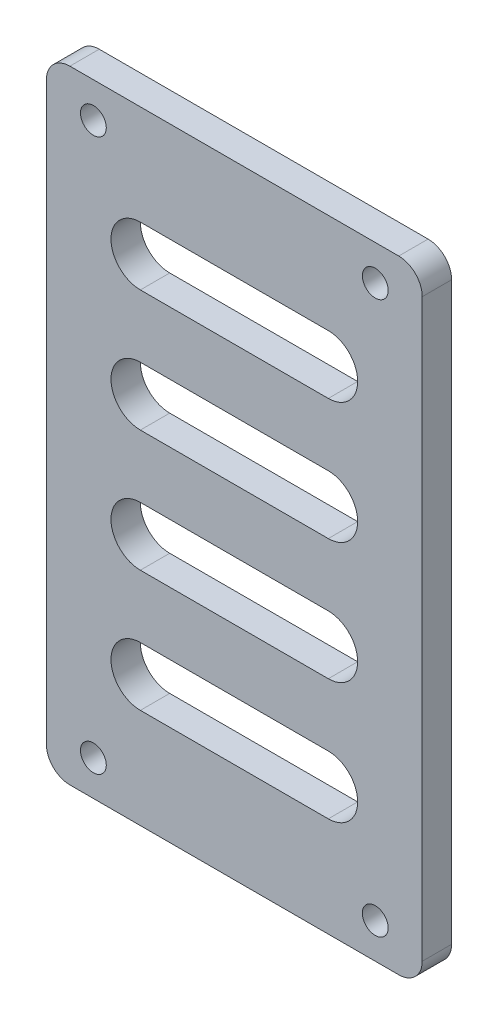
ISO-10303-21;
HEADER;
FILE_DESCRIPTION(('STEP AP214'),'2;1');
FILE_NAME('part.step','',(''),(''),'','','');
FILE_SCHEMA(('AUTOMOTIVE_DESIGN { 1 0 10303 214 1 1 1 1 }'));
ENDSEC;
DATA;
#1=APPLICATION_CONTEXT('core data for automotive mechanical design processes');
#2=APPLICATION_PROTOCOL_DEFINITION('international standard','automotive_design',2000,#1);
#3=PRODUCT_CONTEXT('',#1,'mechanical');
#4=PRODUCT('Part','Part','',(#3));
#5=PRODUCT_RELATED_PRODUCT_CATEGORY('part','',(#4));
#6=PRODUCT_DEFINITION_FORMATION('','',#4);
#7=PRODUCT_DEFINITION_CONTEXT('part definition',#1,'design');
#8=PRODUCT_DEFINITION('design','',#6,#7);
#9=PRODUCT_DEFINITION_SHAPE('','',#8);
#10=(LENGTH_UNIT() NAMED_UNIT(*) SI_UNIT(.MILLI.,.METRE.));
#11=(NAMED_UNIT(*) PLANE_ANGLE_UNIT() SI_UNIT($,.RADIAN.));
#12=(NAMED_UNIT(*) SI_UNIT($,.STERADIAN.) SOLID_ANGLE_UNIT());
#13=UNCERTAINTY_MEASURE_WITH_UNIT(LENGTH_MEASURE(1.E-05),#10,'distance_accuracy_value','');
#14=(GEOMETRIC_REPRESENTATION_CONTEXT(3) GLOBAL_UNCERTAINTY_ASSIGNED_CONTEXT((#13)) GLOBAL_UNIT_ASSIGNED_CONTEXT((#10,
#11,#12)) REPRESENTATION_CONTEXT('',''));
#15=CARTESIAN_POINT('',(0.,0.,0.));
#16=DIRECTION('',(0.,0.,1.));
#17=DIRECTION('',(1.,0.,0.));
#18=AXIS2_PLACEMENT_3D('',#15,#16,#17);
#19=CARTESIAN_POINT('',(0.,0.,2.5));
#20=DIRECTION('',(0.,0.,-1.));
#21=DIRECTION('',(-1.,0.,0.));
#22=AXIS2_PLACEMENT_3D('',#19,#20,#21);
#23=PLANE('',#22);
#24=DIRECTION('',(1.,0.,0.));
#25=VECTOR('',#24,1.);
#26=CARTESIAN_POINT('',(-8.,13.,2.5));
#27=LINE('',#26,#25);
#28=CARTESIAN_POINT('',(-8.,13.,2.5));
#29=VERTEX_POINT('',#28);
#30=CARTESIAN_POINT('',(8.,13.,2.5));
#31=VERTEX_POINT('',#30);
#32=EDGE_CURVE('E247',#29,#31,#27,.T.);
#33=ORIENTED_EDGE('',*,*,#32,.F.);
#34=CARTESIAN_POINT('',(-8.,15.5,2.5));
#35=DIRECTION('',(0.,0.,1.));
#36=DIRECTION('',(1.,0.,0.));
#37=AXIS2_PLACEMENT_3D('',#34,#35,#36);
#38=CIRCLE('',#37,2.5);
#39=CARTESIAN_POINT('',(-8.,18.,2.5));
#40=VERTEX_POINT('',#39);
#41=EDGE_CURVE('E214',#40,#29,#38,.T.);
#42=ORIENTED_EDGE('',*,*,#41,.F.);
#43=DIRECTION('',(-1.,0.,0.));
#44=VECTOR('',#43,1.);
#45=CARTESIAN_POINT('',(-8.,18.,2.5));
#46=LINE('',#45,#44);
#47=CARTESIAN_POINT('',(8.,18.,2.5));
#48=VERTEX_POINT('',#47);
#49=EDGE_CURVE('E237',#48,#40,#46,.T.);
#50=ORIENTED_EDGE('',*,*,#49,.F.);
#51=CARTESIAN_POINT('',(8.,15.5,2.5));
#52=DIRECTION('',(0.,0.,1.));
#53=DIRECTION('',(1.,0.,0.));
#54=AXIS2_PLACEMENT_3D('',#51,#52,#53);
#55=CIRCLE('',#54,2.5);
#56=EDGE_CURVE('E238',#31,#48,#55,.T.);
#57=ORIENTED_EDGE('',*,*,#56,.F.);
#58=EDGE_LOOP('',(#33,#42,#50,#57));
#59=FACE_BOUND('',#58,.T.);
#60=DIRECTION('',(1.,0.,0.));
#61=VECTOR('',#60,1.);
#62=CARTESIAN_POINT('',(-7.99999999999989,2.66666666666666,2.5));
#63=LINE('',#62,#61);
#64=CARTESIAN_POINT('',(-7.99999999999989,2.66666666666666,2.5));
#65=VERTEX_POINT('',#64);
#66=CARTESIAN_POINT('',(8.00000000000011,2.66666666666666,2.5));
#67=VERTEX_POINT('',#66);
#68=EDGE_CURVE('E287',#65,#67,#63,.T.);
#69=ORIENTED_EDGE('',*,*,#68,.F.);
#70=CARTESIAN_POINT('',(-7.99999999999989,5.16666666666667,2.5));
#71=DIRECTION('',(0.,0.,1.));
#72=DIRECTION('',(1.,0.,0.));
#73=AXIS2_PLACEMENT_3D('',#70,#71,#72);
#74=CIRCLE('',#73,2.5);
#75=CARTESIAN_POINT('',(-7.99999999999989,7.66666666666667,2.5));
#76=VERTEX_POINT('',#75);
#77=EDGE_CURVE('E249',#76,#65,#74,.T.);
#78=ORIENTED_EDGE('',*,*,#77,.F.);
#79=DIRECTION('',(-1.,0.,0.));
#80=VECTOR('',#79,1.);
#81=CARTESIAN_POINT('',(-7.99999999999989,7.66666666666667,2.5));
#82=LINE('',#81,#80);
#83=CARTESIAN_POINT('',(8.00000000000011,7.66666666666667,2.5));
#84=VERTEX_POINT('',#83);
#85=EDGE_CURVE('E278',#84,#76,#82,.T.);
#86=ORIENTED_EDGE('',*,*,#85,.F.);
#87=CARTESIAN_POINT('',(8.00000000000011,5.16666666666667,2.5));
#88=DIRECTION('',(0.,0.,1.));
#89=DIRECTION('',(1.,0.,0.));
#90=AXIS2_PLACEMENT_3D('',#87,#88,#89);
#91=CIRCLE('',#90,2.5);
#92=EDGE_CURVE('E285',#67,#84,#91,.T.);
#93=ORIENTED_EDGE('',*,*,#92,.F.);
#94=EDGE_LOOP('',(#69,#78,#86,#93));
#95=FACE_BOUND('',#94,.T.);
#96=DIRECTION('',(1.,0.,0.));
#97=VECTOR('',#96,1.);
#98=CARTESIAN_POINT('',(-7.99999999999979,-7.66666666666667,2.5));
#99=LINE('',#98,#97);
#100=CARTESIAN_POINT('',(-7.99999999999979,-7.66666666666667,2.5));
#101=VERTEX_POINT('',#100);
#102=CARTESIAN_POINT('',(8.00000000000021,-7.66666666666667,2.5));
#103=VERTEX_POINT('',#102);
#104=EDGE_CURVE('E334',#101,#103,#99,.T.);
#105=ORIENTED_EDGE('',*,*,#104,.F.);
#106=CARTESIAN_POINT('',(-7.99999999999979,-5.16666666666667,2.5));
#107=DIRECTION('',(0.,0.,1.));
#108=DIRECTION('',(1.,0.,0.));
#109=AXIS2_PLACEMENT_3D('',#106,#107,#108);
#110=CIRCLE('',#109,2.5);
#111=CARTESIAN_POINT('',(-7.99999999999979,-2.66666666666667,2.5));
#112=VERTEX_POINT('',#111);
#113=EDGE_CURVE('E276',#112,#101,#110,.T.);
#114=ORIENTED_EDGE('',*,*,#113,.F.);
#115=DIRECTION('',(-1.,0.,0.));
#116=VECTOR('',#115,1.);
#117=CARTESIAN_POINT('',(-7.99999999999979,-2.66666666666667,2.5));
#118=LINE('',#117,#116);
#119=CARTESIAN_POINT('',(8.00000000000021,-2.66666666666667,2.5));
#120=VERTEX_POINT('',#119);
#121=EDGE_CURVE('E322',#120,#112,#118,.T.);
#122=ORIENTED_EDGE('',*,*,#121,.F.);
#123=CARTESIAN_POINT('',(8.00000000000021,-5.16666666666667,2.5));
#124=DIRECTION('',(0.,0.,1.));
#125=DIRECTION('',(1.,0.,0.));
#126=AXIS2_PLACEMENT_3D('',#123,#124,#125);
#127=CIRCLE('',#126,2.5);
#128=EDGE_CURVE('E327',#103,#120,#127,.T.);
#129=ORIENTED_EDGE('',*,*,#128,.F.);
#130=EDGE_LOOP('',(#105,#114,#122,#129));
#131=FACE_BOUND('',#130,.T.);
#132=DIRECTION('',(1.,0.,0.));
#133=VECTOR('',#132,1.);
#134=CARTESIAN_POINT('',(-7.99999999999968,-18.,2.5));
#135=LINE('',#134,#133);
#136=CARTESIAN_POINT('',(-7.99999999999968,-18.,2.5));
#137=VERTEX_POINT('',#136);
#138=CARTESIAN_POINT('',(8.00000000000032,-18.,2.5));
#139=VERTEX_POINT('',#138);
#140=EDGE_CURVE('E376',#137,#139,#135,.T.);
#141=ORIENTED_EDGE('',*,*,#140,.F.);
#142=CARTESIAN_POINT('',(-7.99999999999968,-15.5,2.5));
#143=DIRECTION('',(0.,0.,1.));
#144=DIRECTION('',(1.,0.,0.));
#145=AXIS2_PLACEMENT_3D('',#142,#143,#144);
#146=CIRCLE('',#145,2.5);
#147=CARTESIAN_POINT('',(-7.99999999999968,-13.,2.5));
#148=VERTEX_POINT('',#147);
#149=EDGE_CURVE('E323',#148,#137,#146,.T.);
#150=ORIENTED_EDGE('',*,*,#149,.F.);
#151=DIRECTION('',(-1.,0.,0.));
#152=VECTOR('',#151,1.);
#153=CARTESIAN_POINT('',(-7.99999999999968,-13.,2.5));
#154=LINE('',#153,#152);
#155=CARTESIAN_POINT('',(8.00000000000032,-13.,2.5));
#156=VERTEX_POINT('',#155);
#157=EDGE_CURVE('E370',#156,#148,#154,.T.);
#158=ORIENTED_EDGE('',*,*,#157,.F.);
#159=CARTESIAN_POINT('',(7.99999999999968,-15.5,2.5));
#160=DIRECTION('',(0.,0.,1.));
#161=DIRECTION('',(1.,0.,0.));
#162=AXIS2_PLACEMENT_3D('',#159,#160,#161);
#163=CIRCLE('',#162,2.5);
#164=EDGE_CURVE('E371',#139,#156,#163,.T.);
#165=ORIENTED_EDGE('',*,*,#164,.F.);
#166=EDGE_LOOP('',(#141,#150,#158,#165));
#167=FACE_BOUND('',#166,.T.);
#168=DIRECTION('',(0.,-1.,0.));
#169=VECTOR('',#168,1.);
#170=CARTESIAN_POINT('',(-16.,-26.5,2.5));
#171=LINE('',#170,#169);
#172=CARTESIAN_POINT('',(-16.,24.5,2.5));
#173=VERTEX_POINT('',#172);
#174=CARTESIAN_POINT('',(-16.,-24.5,2.5));
#175=VERTEX_POINT('',#174);
#176=EDGE_CURVE('E434',#173,#175,#171,.T.);
#177=ORIENTED_EDGE('',*,*,#176,.T.);
#178=CARTESIAN_POINT('',(-14.,-24.5,2.5));
#179=DIRECTION('',(0.,0.,-1.));
#180=DIRECTION('',(-1.,0.,0.));
#181=AXIS2_PLACEMENT_3D('',#178,#179,#180);
#182=CIRCLE('',#181,2.);
#183=CARTESIAN_POINT('',(-14.,-26.5,2.5));
#184=VERTEX_POINT('',#183);
#185=EDGE_CURVE('E489',#175,#184,#182,.F.);
#186=ORIENTED_EDGE('',*,*,#185,.T.);
#187=DIRECTION('',(1.,0.,0.));
#188=VECTOR('',#187,1.);
#189=CARTESIAN_POINT('',(-16.,-26.5,2.5));
#190=LINE('',#189,#188);
#191=CARTESIAN_POINT('',(14.,-26.5,2.5));
#192=VERTEX_POINT('',#191);
#193=EDGE_CURVE('E438',#184,#192,#190,.T.);
#194=ORIENTED_EDGE('',*,*,#193,.T.);
#195=CARTESIAN_POINT('',(14.,-24.5,2.5));
#196=DIRECTION('',(0.,0.,-1.));
#197=DIRECTION('',(-1.,0.,0.));
#198=AXIS2_PLACEMENT_3D('',#195,#196,#197);
#199=CIRCLE('',#198,2.);
#200=CARTESIAN_POINT('',(16.,-24.5,2.5));
#201=VERTEX_POINT('',#200);
#202=EDGE_CURVE('E490',#192,#201,#199,.F.);
#203=ORIENTED_EDGE('',*,*,#202,.T.);
#204=DIRECTION('',(0.,1.,0.));
#205=VECTOR('',#204,1.);
#206=CARTESIAN_POINT('',(16.,-26.5,2.5));
#207=LINE('',#206,#205);
#208=CARTESIAN_POINT('',(16.,24.5,2.5));
#209=VERTEX_POINT('',#208);
#210=EDGE_CURVE('E428',#201,#209,#207,.T.);
#211=ORIENTED_EDGE('',*,*,#210,.T.);
#212=CARTESIAN_POINT('',(14.,24.5,2.5));
#213=DIRECTION('',(0.,0.,-1.));
#214=DIRECTION('',(-1.,0.,0.));
#215=AXIS2_PLACEMENT_3D('',#212,#213,#214);
#216=CIRCLE('',#215,2.);
#217=CARTESIAN_POINT('',(14.,26.5,2.5));
#218=VERTEX_POINT('',#217);
#219=EDGE_CURVE('E70',#209,#218,#216,.F.);
#220=ORIENTED_EDGE('',*,*,#219,.T.);
#221=DIRECTION('',(-1.,0.,0.));
#222=VECTOR('',#221,1.);
#223=CARTESIAN_POINT('',(-16.,26.5,2.5));
#224=LINE('',#223,#222);
#225=CARTESIAN_POINT('',(-14.,26.5,2.5));
#226=VERTEX_POINT('',#225);
#227=EDGE_CURVE('E431',#218,#226,#224,.T.);
#228=ORIENTED_EDGE('',*,*,#227,.T.);
#229=CARTESIAN_POINT('',(-14.,24.5,2.5));
#230=DIRECTION('',(0.,0.,-1.));
#231=DIRECTION('',(-1.,0.,0.));
#232=AXIS2_PLACEMENT_3D('',#229,#230,#231);
#233=CIRCLE('',#232,2.);
#234=EDGE_CURVE('E485',#226,#173,#233,.F.);
#235=ORIENTED_EDGE('',*,*,#234,.T.);
#236=EDGE_LOOP('',(#177,#186,#194,#203,#211,#220,#228,#235));
#237=FACE_BOUND('',#236,.T.);
#238=CARTESIAN_POINT('',(-12.,23.5,2.5));
#239=DIRECTION('',(0.,0.,1.));
#240=DIRECTION('',(1.,0.,0.));
#241=AXIS2_PLACEMENT_3D('',#238,#239,#240);
#242=CIRCLE('',#241,1.1);
#243=CARTESIAN_POINT('',(-10.9,23.5,2.5));
#244=VERTEX_POINT('',#243);
#245=EDGE_CURVE('E419',#244,#244,#242,.T.);
#246=ORIENTED_EDGE('',*,*,#245,.F.);
#247=EDGE_LOOP('',(#246));
#248=FACE_BOUND('',#247,.T.);
#249=CARTESIAN_POINT('',(12.,-23.5,2.5));
#250=DIRECTION('',(0.,0.,1.));
#251=DIRECTION('',(1.,0.,0.));
#252=AXIS2_PLACEMENT_3D('',#249,#250,#251);
#253=CIRCLE('',#252,1.1);
#254=CARTESIAN_POINT('',(13.1,-23.5,2.5));
#255=VERTEX_POINT('',#254);
#256=EDGE_CURVE('E415',#255,#255,#253,.T.);
#257=ORIENTED_EDGE('',*,*,#256,.F.);
#258=EDGE_LOOP('',(#257));
#259=FACE_BOUND('',#258,.T.);
#260=CARTESIAN_POINT('',(12.,23.5,2.5));
#261=DIRECTION('',(0.,0.,1.));
#262=DIRECTION('',(1.,0.,0.));
#263=AXIS2_PLACEMENT_3D('',#260,#261,#262);
#264=CIRCLE('',#263,1.09999999999999);
#265=CARTESIAN_POINT('',(13.1,23.5,2.5));
#266=VERTEX_POINT('',#265);
#267=EDGE_CURVE('E404',#266,#266,#264,.T.);
#268=ORIENTED_EDGE('',*,*,#267,.F.);
#269=EDGE_LOOP('',(#268));
#270=FACE_BOUND('',#269,.T.);
#271=CARTESIAN_POINT('',(-12.,-23.5,2.5));
#272=DIRECTION('',(0.,0.,1.));
#273=DIRECTION('',(1.,0.,0.));
#274=AXIS2_PLACEMENT_3D('',#271,#272,#273);
#275=CIRCLE('',#274,1.10000000000001);
#276=CARTESIAN_POINT('',(-10.9,-23.5,2.5));
#277=VERTEX_POINT('',#276);
#278=EDGE_CURVE('E396',#277,#277,#275,.T.);
#279=ORIENTED_EDGE('',*,*,#278,.F.);
#280=EDGE_LOOP('',(#279));
#281=FACE_BOUND('',#280,.T.);
#282=ADVANCED_FACE('F44',(#59,#95,#131,#167,#237,#248,#259,#270,#281),#23,.F.);
#283=CARTESIAN_POINT('',(0.,0.,0.));
#284=DIRECTION('',(0.,0.,-1.));
#285=DIRECTION('',(-1.,0.,0.));
#286=AXIS2_PLACEMENT_3D('',#283,#284,#285);
#287=PLANE('',#286);
#288=CARTESIAN_POINT('',(-8.,15.5,0.));
#289=DIRECTION('',(0.,0.,1.));
#290=DIRECTION('',(1.,0.,0.));
#291=AXIS2_PLACEMENT_3D('',#288,#289,#290);
#292=CIRCLE('',#291,2.5);
#293=CARTESIAN_POINT('',(-8.,18.,0.));
#294=VERTEX_POINT('',#293);
#295=CARTESIAN_POINT('',(-8.,13.,0.));
#296=VERTEX_POINT('',#295);
#297=EDGE_CURVE('E215',#294,#296,#292,.T.);
#298=ORIENTED_EDGE('',*,*,#297,.T.);
#299=DIRECTION('',(1.,0.,0.));
#300=VECTOR('',#299,1.);
#301=CARTESIAN_POINT('',(-8.,13.,0.));
#302=LINE('',#301,#300);
#303=CARTESIAN_POINT('',(8.,13.,0.));
#304=VERTEX_POINT('',#303);
#305=EDGE_CURVE('E223',#296,#304,#302,.T.);
#306=ORIENTED_EDGE('',*,*,#305,.T.);
#307=CARTESIAN_POINT('',(8.,15.5,0.));
#308=DIRECTION('',(0.,0.,1.));
#309=DIRECTION('',(1.,0.,0.));
#310=AXIS2_PLACEMENT_3D('',#307,#308,#309);
#311=CIRCLE('',#310,2.5);
#312=CARTESIAN_POINT('',(8.,18.,0.));
#313=VERTEX_POINT('',#312);
#314=EDGE_CURVE('E226',#304,#313,#311,.T.);
#315=ORIENTED_EDGE('',*,*,#314,.T.);
#316=DIRECTION('',(-1.,0.,0.));
#317=VECTOR('',#316,1.);
#318=CARTESIAN_POINT('',(-8.,18.,0.));
#319=LINE('',#318,#317);
#320=EDGE_CURVE('E222',#313,#294,#319,.T.);
#321=ORIENTED_EDGE('',*,*,#320,.T.);
#322=EDGE_LOOP('',(#298,#306,#315,#321));
#323=FACE_BOUND('',#322,.T.);
#324=CARTESIAN_POINT('',(-7.99999999999989,5.16666666666667,0.));
#325=DIRECTION('',(0.,0.,1.));
#326=DIRECTION('',(1.,0.,0.));
#327=AXIS2_PLACEMENT_3D('',#324,#325,#326);
#328=CIRCLE('',#327,2.5);
#329=CARTESIAN_POINT('',(-7.99999999999989,7.66666666666667,0.));
#330=VERTEX_POINT('',#329);
#331=CARTESIAN_POINT('',(-7.99999999999989,2.66666666666666,0.));
#332=VERTEX_POINT('',#331);
#333=EDGE_CURVE('E281',#330,#332,#328,.T.);
#334=ORIENTED_EDGE('',*,*,#333,.T.);
#335=DIRECTION('',(1.,0.,0.));
#336=VECTOR('',#335,1.);
#337=CARTESIAN_POINT('',(-7.99999999999989,2.66666666666666,0.));
#338=LINE('',#337,#336);
#339=CARTESIAN_POINT('',(8.00000000000011,2.66666666666666,0.));
#340=VERTEX_POINT('',#339);
#341=EDGE_CURVE('E305',#332,#340,#338,.T.);
#342=ORIENTED_EDGE('',*,*,#341,.T.);
#343=CARTESIAN_POINT('',(8.00000000000011,5.16666666666667,0.));
#344=DIRECTION('',(0.,0.,1.));
#345=DIRECTION('',(1.,0.,0.));
#346=AXIS2_PLACEMENT_3D('',#343,#344,#345);
#347=CIRCLE('',#346,2.5);
#348=CARTESIAN_POINT('',(8.00000000000011,7.66666666666667,0.));
#349=VERTEX_POINT('',#348);
#350=EDGE_CURVE('E297',#340,#349,#347,.T.);
#351=ORIENTED_EDGE('',*,*,#350,.T.);
#352=DIRECTION('',(-1.,0.,0.));
#353=VECTOR('',#352,1.);
#354=CARTESIAN_POINT('',(-7.99999999999989,7.66666666666667,0.));
#355=LINE('',#354,#353);
#356=EDGE_CURVE('E267',#349,#330,#355,.T.);
#357=ORIENTED_EDGE('',*,*,#356,.T.);
#358=EDGE_LOOP('',(#334,#342,#351,#357));
#359=FACE_BOUND('',#358,.T.);
#360=CARTESIAN_POINT('',(-7.99999999999979,-5.16666666666667,0.));
#361=DIRECTION('',(0.,0.,1.));
#362=DIRECTION('',(1.,0.,0.));
#363=AXIS2_PLACEMENT_3D('',#360,#361,#362);
#364=CIRCLE('',#363,2.5);
#365=CARTESIAN_POINT('',(-7.99999999999979,-2.66666666666667,0.));
#366=VERTEX_POINT('',#365);
#367=CARTESIAN_POINT('',(-7.99999999999979,-7.66666666666667,0.));
#368=VERTEX_POINT('',#367);
#369=EDGE_CURVE('E328',#366,#368,#364,.T.);
#370=ORIENTED_EDGE('',*,*,#369,.T.);
#371=DIRECTION('',(1.,0.,0.));
#372=VECTOR('',#371,1.);
#373=CARTESIAN_POINT('',(-7.99999999999979,-7.66666666666667,0.));
#374=LINE('',#373,#372);
#375=CARTESIAN_POINT('',(8.00000000000021,-7.66666666666667,0.));
#376=VERTEX_POINT('',#375);
#377=EDGE_CURVE('E347',#368,#376,#374,.T.);
#378=ORIENTED_EDGE('',*,*,#377,.T.);
#379=CARTESIAN_POINT('',(8.00000000000021,-5.16666666666667,0.));
#380=DIRECTION('',(0.,0.,1.));
#381=DIRECTION('',(1.,0.,0.));
#382=AXIS2_PLACEMENT_3D('',#379,#380,#381);
#383=CIRCLE('',#382,2.5);
#384=CARTESIAN_POINT('',(8.00000000000021,-2.66666666666667,0.));
#385=VERTEX_POINT('',#384);
#386=EDGE_CURVE('E345',#376,#385,#383,.T.);
#387=ORIENTED_EDGE('',*,*,#386,.T.);
#388=DIRECTION('',(-1.,0.,0.));
#389=VECTOR('',#388,1.);
#390=CARTESIAN_POINT('',(-7.99999999999979,-2.66666666666667,0.));
#391=LINE('',#390,#389);
#392=EDGE_CURVE('E311',#385,#366,#391,.T.);
#393=ORIENTED_EDGE('',*,*,#392,.T.);
#394=EDGE_LOOP('',(#370,#378,#387,#393));
#395=FACE_BOUND('',#394,.T.);
#396=CARTESIAN_POINT('',(-7.99999999999968,-15.5,0.));
#397=DIRECTION('',(0.,0.,1.));
#398=DIRECTION('',(1.,0.,0.));
#399=AXIS2_PLACEMENT_3D('',#396,#397,#398);
#400=CIRCLE('',#399,2.5);
#401=CARTESIAN_POINT('',(-7.99999999999968,-13.,0.));
#402=VERTEX_POINT('',#401);
#403=CARTESIAN_POINT('',(-7.99999999999968,-18.,0.));
#404=VERTEX_POINT('',#403);
#405=EDGE_CURVE('E375',#402,#404,#400,.T.);
#406=ORIENTED_EDGE('',*,*,#405,.T.);
#407=DIRECTION('',(1.,0.,0.));
#408=VECTOR('',#407,1.);
#409=CARTESIAN_POINT('',(-7.99999999999968,-18.,0.));
#410=LINE('',#409,#408);
#411=CARTESIAN_POINT('',(8.00000000000032,-18.,0.));
#412=VERTEX_POINT('',#411);
#413=EDGE_CURVE('E386',#404,#412,#410,.T.);
#414=ORIENTED_EDGE('',*,*,#413,.T.);
#415=CARTESIAN_POINT('',(7.99999999999968,-15.5,0.));
#416=DIRECTION('',(0.,0.,1.));
#417=DIRECTION('',(1.,0.,0.));
#418=AXIS2_PLACEMENT_3D('',#415,#416,#417);
#419=CIRCLE('',#418,2.5);
#420=CARTESIAN_POINT('',(8.00000000000032,-13.,0.));
#421=VERTEX_POINT('',#420);
#422=EDGE_CURVE('E384',#412,#421,#419,.T.);
#423=ORIENTED_EDGE('',*,*,#422,.T.);
#424=DIRECTION('',(-1.,0.,0.));
#425=VECTOR('',#424,1.);
#426=CARTESIAN_POINT('',(-7.99999999999968,-13.,0.));
#427=LINE('',#426,#425);
#428=EDGE_CURVE('E360',#421,#402,#427,.T.);
#429=ORIENTED_EDGE('',*,*,#428,.T.);
#430=EDGE_LOOP('',(#406,#414,#423,#429));
#431=FACE_BOUND('',#430,.T.);
#432=CARTESIAN_POINT('',(12.,23.5,0.));
#433=DIRECTION('',(0.,0.,1.));
#434=DIRECTION('',(1.,0.,0.));
#435=AXIS2_PLACEMENT_3D('',#432,#433,#434);
#436=CIRCLE('',#435,1.09999999999999);
#437=CARTESIAN_POINT('',(13.1,23.5,0.));
#438=VERTEX_POINT('',#437);
#439=EDGE_CURVE('E399',#438,#438,#436,.T.);
#440=ORIENTED_EDGE('',*,*,#439,.T.);
#441=EDGE_LOOP('',(#440));
#442=FACE_BOUND('',#441,.T.);
#443=CARTESIAN_POINT('',(-12.,23.5,0.));
#444=DIRECTION('',(0.,0.,1.));
#445=DIRECTION('',(1.,0.,0.));
#446=AXIS2_PLACEMENT_3D('',#443,#444,#445);
#447=CIRCLE('',#446,1.1);
#448=CARTESIAN_POINT('',(-10.9,23.5,0.));
#449=VERTEX_POINT('',#448);
#450=EDGE_CURVE('E418',#449,#449,#447,.T.);
#451=ORIENTED_EDGE('',*,*,#450,.T.);
#452=EDGE_LOOP('',(#451));
#453=FACE_BOUND('',#452,.T.);
#454=DIRECTION('',(1.,0.,0.));
#455=VECTOR('',#454,1.);
#456=CARTESIAN_POINT('',(-16.,-26.5,0.));
#457=LINE('',#456,#455);
#458=CARTESIAN_POINT('',(-14.,-26.5,0.));
#459=VERTEX_POINT('',#458);
#460=CARTESIAN_POINT('',(14.,-26.5,0.));
#461=VERTEX_POINT('',#460);
#462=EDGE_CURVE('E435',#459,#461,#457,.T.);
#463=ORIENTED_EDGE('',*,*,#462,.F.);
#464=CARTESIAN_POINT('',(-14.,-24.5,0.));
#465=DIRECTION('',(0.,0.,-1.));
#466=DIRECTION('',(-1.,0.,0.));
#467=AXIS2_PLACEMENT_3D('',#464,#465,#466);
#468=CIRCLE('',#467,2.);
#469=CARTESIAN_POINT('',(-16.,-24.5,0.));
#470=VERTEX_POINT('',#469);
#471=EDGE_CURVE('E472',#459,#470,#468,.T.);
#472=ORIENTED_EDGE('',*,*,#471,.T.);
#473=DIRECTION('',(0.,-1.,0.));
#474=VECTOR('',#473,1.);
#475=CARTESIAN_POINT('',(-16.,-26.5,0.));
#476=LINE('',#475,#474);
#477=CARTESIAN_POINT('',(-16.,24.5,0.));
#478=VERTEX_POINT('',#477);
#479=EDGE_CURVE('E446',#478,#470,#476,.T.);
#480=ORIENTED_EDGE('',*,*,#479,.F.);
#481=CARTESIAN_POINT('',(-14.,24.5,0.));
#482=DIRECTION('',(0.,0.,-1.));
#483=DIRECTION('',(-1.,0.,0.));
#484=AXIS2_PLACEMENT_3D('',#481,#482,#483);
#485=CIRCLE('',#484,2.);
#486=CARTESIAN_POINT('',(-14.,26.5,0.));
#487=VERTEX_POINT('',#486);
#488=EDGE_CURVE('E462',#478,#487,#485,.T.);
#489=ORIENTED_EDGE('',*,*,#488,.T.);
#490=DIRECTION('',(-1.,0.,0.));
#491=VECTOR('',#490,1.);
#492=CARTESIAN_POINT('',(-16.,26.5,0.));
#493=LINE('',#492,#491);
#494=CARTESIAN_POINT('',(14.,26.5,0.));
#495=VERTEX_POINT('',#494);
#496=EDGE_CURVE('E449',#495,#487,#493,.T.);
#497=ORIENTED_EDGE('',*,*,#496,.F.);
#498=CARTESIAN_POINT('',(14.,24.5,0.));
#499=DIRECTION('',(0.,0.,-1.));
#500=DIRECTION('',(-1.,0.,0.));
#501=AXIS2_PLACEMENT_3D('',#498,#499,#500);
#502=CIRCLE('',#501,2.);
#503=CARTESIAN_POINT('',(16.,24.5,0.));
#504=VERTEX_POINT('',#503);
#505=EDGE_CURVE('E466',#495,#504,#502,.T.);
#506=ORIENTED_EDGE('',*,*,#505,.T.);
#507=DIRECTION('',(0.,1.,0.));
#508=VECTOR('',#507,1.);
#509=CARTESIAN_POINT('',(16.,-26.5,0.));
#510=LINE('',#509,#508);
#511=CARTESIAN_POINT('',(16.,-24.5,0.));
#512=VERTEX_POINT('',#511);
#513=EDGE_CURVE('E424',#512,#504,#510,.T.);
#514=ORIENTED_EDGE('',*,*,#513,.F.);
#515=CARTESIAN_POINT('',(14.,-24.5,0.));
#516=DIRECTION('',(0.,0.,-1.));
#517=DIRECTION('',(-1.,0.,0.));
#518=AXIS2_PLACEMENT_3D('',#515,#516,#517);
#519=CIRCLE('',#518,2.);
#520=EDGE_CURVE('E467',#512,#461,#519,.T.);
#521=ORIENTED_EDGE('',*,*,#520,.T.);
#522=EDGE_LOOP('',(#463,#472,#480,#489,#497,#506,#514,#521));
#523=FACE_BOUND('',#522,.T.);
#524=CARTESIAN_POINT('',(12.,-23.5,0.));
#525=DIRECTION('',(0.,0.,1.));
#526=DIRECTION('',(1.,0.,0.));
#527=AXIS2_PLACEMENT_3D('',#524,#525,#526);
#528=CIRCLE('',#527,1.1);
#529=CARTESIAN_POINT('',(13.1,-23.5,0.));
#530=VERTEX_POINT('',#529);
#531=EDGE_CURVE('E407',#530,#530,#528,.T.);
#532=ORIENTED_EDGE('',*,*,#531,.T.);
#533=EDGE_LOOP('',(#532));
#534=FACE_BOUND('',#533,.T.);
#535=CARTESIAN_POINT('',(-12.,-23.5,0.));
#536=DIRECTION('',(0.,0.,1.));
#537=DIRECTION('',(1.,0.,0.));
#538=AXIS2_PLACEMENT_3D('',#535,#536,#537);
#539=CIRCLE('',#538,1.10000000000001);
#540=CARTESIAN_POINT('',(-10.9,-23.5,0.));
#541=VERTEX_POINT('',#540);
#542=EDGE_CURVE('E259',#541,#541,#539,.T.);
#543=ORIENTED_EDGE('',*,*,#542,.T.);
#544=EDGE_LOOP('',(#543));
#545=FACE_BOUND('',#544,.T.);
#546=ADVANCED_FACE('F235',(#323,#359,#395,#431,#442,#453,#523,#534,#545),#287,.T.);
#547=CARTESIAN_POINT('',(16.,-26.5,2.5));
#548=DIRECTION('',(-1.,0.,0.));
#549=DIRECTION('',(0.,0.,1.));
#550=AXIS2_PLACEMENT_3D('',#547,#548,#549);
#551=PLANE('',#550);
#552=ORIENTED_EDGE('',*,*,#210,.F.);
#553=DIRECTION('',(0.,0.,-1.));
#554=VECTOR('',#553,1.);
#555=CARTESIAN_POINT('',(16.,-24.5,2.5));
#556=LINE('',#555,#554);
#557=EDGE_CURVE('E497',#201,#512,#556,.T.);
#558=ORIENTED_EDGE('',*,*,#557,.T.);
#559=ORIENTED_EDGE('',*,*,#513,.T.);
#560=DIRECTION('',(0.,0.,-1.));
#561=VECTOR('',#560,1.);
#562=CARTESIAN_POINT('',(16.,24.5,2.5));
#563=LINE('',#562,#561);
#564=EDGE_CURVE('E492',#504,#209,#563,.F.);
#565=ORIENTED_EDGE('',*,*,#564,.T.);
#566=EDGE_LOOP('',(#552,#558,#559,#565));
#567=FACE_BOUND('',#566,.T.);
#568=ADVANCED_FACE('F505',(#567),#551,.F.);
#569=CARTESIAN_POINT('',(-16.,26.5,2.5));
#570=DIRECTION('',(0.,-1.,0.));
#571=DIRECTION('',(1.,0.,0.));
#572=AXIS2_PLACEMENT_3D('',#569,#570,#571);
#573=PLANE('',#572);
#574=ORIENTED_EDGE('',*,*,#227,.F.);
#575=DIRECTION('',(0.,0.,-1.));
#576=VECTOR('',#575,1.);
#577=CARTESIAN_POINT('',(14.,26.5,2.5));
#578=LINE('',#577,#576);
#579=EDGE_CURVE('E11',#218,#495,#578,.T.);
#580=ORIENTED_EDGE('',*,*,#579,.T.);
#581=ORIENTED_EDGE('',*,*,#496,.T.);
#582=DIRECTION('',(0.,0.,-1.));
#583=VECTOR('',#582,1.);
#584=CARTESIAN_POINT('',(-14.,26.5,2.5));
#585=LINE('',#584,#583);
#586=EDGE_CURVE('E53',#487,#226,#585,.F.);
#587=ORIENTED_EDGE('',*,*,#586,.T.);
#588=EDGE_LOOP('',(#574,#580,#581,#587));
#589=FACE_BOUND('',#588,.T.);
#590=ADVANCED_FACE('F513',(#589),#573,.F.);
#591=CARTESIAN_POINT('',(-16.,-26.5,2.5));
#592=DIRECTION('',(1.,0.,0.));
#593=DIRECTION('',(0.,0.,-1.));
#594=AXIS2_PLACEMENT_3D('',#591,#592,#593);
#595=PLANE('',#594);
#596=ORIENTED_EDGE('',*,*,#479,.T.);
#597=DIRECTION('',(0.,0.,-1.));
#598=VECTOR('',#597,1.);
#599=CARTESIAN_POINT('',(-16.,-24.5,2.5));
#600=LINE('',#599,#598);
#601=EDGE_CURVE('E479',#470,#175,#600,.F.);
#602=ORIENTED_EDGE('',*,*,#601,.T.);
#603=ORIENTED_EDGE('',*,*,#176,.F.);
#604=DIRECTION('',(0.,0.,-1.));
#605=VECTOR('',#604,1.);
#606=CARTESIAN_POINT('',(-16.,24.5,2.5));
#607=LINE('',#606,#605);
#608=EDGE_CURVE('E474',#173,#478,#607,.T.);
#609=ORIENTED_EDGE('',*,*,#608,.T.);
#610=EDGE_LOOP('',(#596,#602,#603,#609));
#611=FACE_BOUND('',#610,.T.);
#612=ADVANCED_FACE('F523',(#611),#595,.F.);
#613=CARTESIAN_POINT('',(-16.,-26.5,2.5));
#614=DIRECTION('',(0.,1.,0.));
#615=DIRECTION('',(-1.,0.,0.));
#616=AXIS2_PLACEMENT_3D('',#613,#614,#615);
#617=PLANE('',#616);
#618=ORIENTED_EDGE('',*,*,#193,.F.);
#619=DIRECTION('',(0.,0.,-1.));
#620=VECTOR('',#619,1.);
#621=CARTESIAN_POINT('',(-14.,-26.5,2.5));
#622=LINE('',#621,#620);
#623=EDGE_CURVE('E459',#184,#459,#622,.T.);
#624=ORIENTED_EDGE('',*,*,#623,.T.);
#625=ORIENTED_EDGE('',*,*,#462,.T.);
#626=DIRECTION('',(0.,0.,-1.));
#627=VECTOR('',#626,1.);
#628=CARTESIAN_POINT('',(14.,-26.5,2.5));
#629=LINE('',#628,#627);
#630=EDGE_CURVE('E444',#461,#192,#629,.F.);
#631=ORIENTED_EDGE('',*,*,#630,.T.);
#632=EDGE_LOOP('',(#618,#624,#625,#631));
#633=FACE_BOUND('',#632,.T.);
#634=ADVANCED_FACE('F533',(#633),#617,.F.);
#635=CARTESIAN_POINT('',(-12.,23.5,2.5));
#636=DIRECTION('',(0.,0.,-1.));
#637=DIRECTION('',(-1.,0.,0.));
#638=AXIS2_PLACEMENT_3D('',#635,#636,#637);
#639=CYLINDRICAL_SURFACE('',#638,1.1);
#640=ORIENTED_EDGE('',*,*,#245,.T.);
#641=EDGE_LOOP('',(#640));
#642=FACE_BOUND('',#641,.T.);
#643=ORIENTED_EDGE('',*,*,#450,.F.);
#644=EDGE_LOOP('',(#643));
#645=FACE_BOUND('',#644,.T.);
#646=ADVANCED_FACE('F552',(#642,#645),#639,.F.);
#647=CARTESIAN_POINT('',(12.,-23.5,2.5));
#648=DIRECTION('',(0.,0.,-1.));
#649=DIRECTION('',(-1.,0.,0.));
#650=AXIS2_PLACEMENT_3D('',#647,#648,#649);
#651=CYLINDRICAL_SURFACE('',#650,1.1);
#652=ORIENTED_EDGE('',*,*,#256,.T.);
#653=EDGE_LOOP('',(#652));
#654=FACE_BOUND('',#653,.T.);
#655=ORIENTED_EDGE('',*,*,#531,.F.);
#656=EDGE_LOOP('',(#655));
#657=FACE_BOUND('',#656,.T.);
#658=ADVANCED_FACE('F780',(#654,#657),#651,.F.);
#659=CARTESIAN_POINT('',(12.,23.5,2.5));
#660=DIRECTION('',(0.,0.,-1.));
#661=DIRECTION('',(-1.,0.,0.));
#662=AXIS2_PLACEMENT_3D('',#659,#660,#661);
#663=CYLINDRICAL_SURFACE('',#662,1.09999999999999);
#664=ORIENTED_EDGE('',*,*,#267,.T.);
#665=EDGE_LOOP('',(#664));
#666=FACE_BOUND('',#665,.T.);
#667=ORIENTED_EDGE('',*,*,#439,.F.);
#668=EDGE_LOOP('',(#667));
#669=FACE_BOUND('',#668,.T.);
#670=ADVANCED_FACE('F768',(#666,#669),#663,.F.);
#671=CARTESIAN_POINT('',(-12.,-23.5,2.5));
#672=DIRECTION('',(0.,0.,-1.));
#673=DIRECTION('',(-1.,0.,0.));
#674=AXIS2_PLACEMENT_3D('',#671,#672,#673);
#675=CYLINDRICAL_SURFACE('',#674,1.10000000000001);
#676=ORIENTED_EDGE('',*,*,#278,.T.);
#677=EDGE_LOOP('',(#676));
#678=FACE_BOUND('',#677,.T.);
#679=ORIENTED_EDGE('',*,*,#542,.F.);
#680=EDGE_LOOP('',(#679));
#681=FACE_BOUND('',#680,.T.);
#682=ADVANCED_FACE('F757',(#678,#681),#675,.F.);
#683=CARTESIAN_POINT('',(-7.99999999999968,-15.5,0.));
#684=DIRECTION('',(0.,0.,1.));
#685=DIRECTION('',(1.,0.,0.));
#686=AXIS2_PLACEMENT_3D('',#683,#684,#685);
#687=CYLINDRICAL_SURFACE('',#686,2.5);
#688=ORIENTED_EDGE('',*,*,#149,.T.);
#689=DIRECTION('',(0.,0.,1.));
#690=VECTOR('',#689,1.);
#691=CARTESIAN_POINT('',(-7.99999999999968,-18.,0.));
#692=LINE('',#691,#690);
#693=EDGE_CURVE('E352',#404,#137,#692,.T.);
#694=ORIENTED_EDGE('',*,*,#693,.F.);
#695=ORIENTED_EDGE('',*,*,#405,.F.);
#696=DIRECTION('',(0.,0.,1.));
#697=VECTOR('',#696,1.);
#698=CARTESIAN_POINT('',(-7.99999999999968,-13.,0.));
#699=LINE('',#698,#697);
#700=EDGE_CURVE('E365',#402,#148,#699,.T.);
#701=ORIENTED_EDGE('',*,*,#700,.T.);
#702=EDGE_LOOP('',(#688,#694,#695,#701));
#703=FACE_BOUND('',#702,.T.);
#704=ADVANCED_FACE('F750',(#703),#687,.F.);
#705=CARTESIAN_POINT('',(-7.99999999999968,-13.,0.));
#706=DIRECTION('',(0.,1.,0.));
#707=DIRECTION('',(0.,0.,1.));
#708=AXIS2_PLACEMENT_3D('',#705,#706,#707);
#709=PLANE('',#708);
#710=ORIENTED_EDGE('',*,*,#157,.T.);
#711=ORIENTED_EDGE('',*,*,#700,.F.);
#712=ORIENTED_EDGE('',*,*,#428,.F.);
#713=DIRECTION('',(0.,0.,1.));
#714=VECTOR('',#713,1.);
#715=CARTESIAN_POINT('',(8.00000000000032,-13.,0.));
#716=LINE('',#715,#714);
#717=EDGE_CURVE('E363',#421,#156,#716,.T.);
#718=ORIENTED_EDGE('',*,*,#717,.T.);
#719=EDGE_LOOP('',(#710,#711,#712,#718));
#720=FACE_BOUND('',#719,.T.);
#721=ADVANCED_FACE('F740',(#720),#709,.F.);
#722=CARTESIAN_POINT('',(7.99999999999968,-15.5,0.));
#723=DIRECTION('',(0.,0.,1.));
#724=DIRECTION('',(1.,0.,0.));
#725=AXIS2_PLACEMENT_3D('',#722,#723,#724);
#726=CYLINDRICAL_SURFACE('',#725,2.5);
#727=ORIENTED_EDGE('',*,*,#164,.T.);
#728=ORIENTED_EDGE('',*,*,#717,.F.);
#729=ORIENTED_EDGE('',*,*,#422,.F.);
#730=DIRECTION('',(0.,0.,1.));
#731=VECTOR('',#730,1.);
#732=CARTESIAN_POINT('',(8.00000000000032,-18.,0.));
#733=LINE('',#732,#731);
#734=EDGE_CURVE('E358',#412,#139,#733,.T.);
#735=ORIENTED_EDGE('',*,*,#734,.T.);
#736=EDGE_LOOP('',(#727,#728,#729,#735));
#737=FACE_BOUND('',#736,.T.);
#738=ADVANCED_FACE('F727',(#737),#726,.F.);
#739=CARTESIAN_POINT('',(-7.99999999999968,-18.,0.));
#740=DIRECTION('',(0.,-1.,0.));
#741=DIRECTION('',(0.,0.,-1.));
#742=AXIS2_PLACEMENT_3D('',#739,#740,#741);
#743=PLANE('',#742);
#744=ORIENTED_EDGE('',*,*,#140,.T.);
#745=ORIENTED_EDGE('',*,*,#734,.F.);
#746=ORIENTED_EDGE('',*,*,#413,.F.);
#747=ORIENTED_EDGE('',*,*,#693,.T.);
#748=EDGE_LOOP('',(#744,#745,#746,#747));
#749=FACE_BOUND('',#748,.T.);
#750=ADVANCED_FACE('F716',(#749),#743,.F.);
#751=CARTESIAN_POINT('',(-7.99999999999979,-5.16666666666667,0.));
#752=DIRECTION('',(0.,0.,1.));
#753=DIRECTION('',(1.,0.,0.));
#754=AXIS2_PLACEMENT_3D('',#751,#752,#753);
#755=CYLINDRICAL_SURFACE('',#754,2.5);
#756=ORIENTED_EDGE('',*,*,#113,.T.);
#757=DIRECTION('',(0.,0.,1.));
#758=VECTOR('',#757,1.);
#759=CARTESIAN_POINT('',(-7.99999999999979,-7.66666666666667,0.));
#760=LINE('',#759,#758);
#761=EDGE_CURVE('E310',#368,#101,#760,.T.);
#762=ORIENTED_EDGE('',*,*,#761,.F.);
#763=ORIENTED_EDGE('',*,*,#369,.F.);
#764=DIRECTION('',(0.,0.,1.));
#765=VECTOR('',#764,1.);
#766=CARTESIAN_POINT('',(-7.99999999999979,-2.66666666666667,0.));
#767=LINE('',#766,#765);
#768=EDGE_CURVE('E319',#366,#112,#767,.T.);
#769=ORIENTED_EDGE('',*,*,#768,.T.);
#770=EDGE_LOOP('',(#756,#762,#763,#769));
#771=FACE_BOUND('',#770,.T.);
#772=ADVANCED_FACE('F707',(#771),#755,.F.);
#773=CARTESIAN_POINT('',(-7.99999999999979,-2.66666666666667,0.));
#774=DIRECTION('',(0.,1.,0.));
#775=DIRECTION('',(0.,0.,1.));
#776=AXIS2_PLACEMENT_3D('',#773,#774,#775);
#777=PLANE('',#776);
#778=ORIENTED_EDGE('',*,*,#121,.T.);
#779=ORIENTED_EDGE('',*,*,#768,.F.);
#780=ORIENTED_EDGE('',*,*,#392,.F.);
#781=DIRECTION('',(0.,0.,1.));
#782=VECTOR('',#781,1.);
#783=CARTESIAN_POINT('',(8.00000000000021,-2.66666666666667,0.));
#784=LINE('',#783,#782);
#785=EDGE_CURVE('E320',#385,#120,#784,.T.);
#786=ORIENTED_EDGE('',*,*,#785,.T.);
#787=EDGE_LOOP('',(#778,#779,#780,#786));
#788=FACE_BOUND('',#787,.T.);
#789=ADVANCED_FACE('F699',(#788),#777,.F.);
#790=CARTESIAN_POINT('',(8.00000000000021,-5.16666666666667,0.));
#791=DIRECTION('',(0.,0.,1.));
#792=DIRECTION('',(1.,0.,0.));
#793=AXIS2_PLACEMENT_3D('',#790,#791,#792);
#794=CYLINDRICAL_SURFACE('',#793,2.5);
#795=ORIENTED_EDGE('',*,*,#128,.T.);
#796=ORIENTED_EDGE('',*,*,#785,.F.);
#797=ORIENTED_EDGE('',*,*,#386,.F.);
#798=DIRECTION('',(0.,0.,1.));
#799=VECTOR('',#798,1.);
#800=CARTESIAN_POINT('',(8.00000000000021,-7.66666666666667,0.));
#801=LINE('',#800,#799);
#802=EDGE_CURVE('E314',#376,#103,#801,.T.);
#803=ORIENTED_EDGE('',*,*,#802,.T.);
#804=EDGE_LOOP('',(#795,#796,#797,#803));
#805=FACE_BOUND('',#804,.T.);
#806=ADVANCED_FACE('F687',(#805),#794,.F.);
#807=CARTESIAN_POINT('',(-7.99999999999979,-7.66666666666667,0.));
#808=DIRECTION('',(0.,-1.,0.));
#809=DIRECTION('',(0.,0.,-1.));
#810=AXIS2_PLACEMENT_3D('',#807,#808,#809);
#811=PLANE('',#810);
#812=ORIENTED_EDGE('',*,*,#104,.T.);
#813=ORIENTED_EDGE('',*,*,#802,.F.);
#814=ORIENTED_EDGE('',*,*,#377,.F.);
#815=ORIENTED_EDGE('',*,*,#761,.T.);
#816=EDGE_LOOP('',(#812,#813,#814,#815));
#817=FACE_BOUND('',#816,.T.);
#818=ADVANCED_FACE('F679',(#817),#811,.F.);
#819=CARTESIAN_POINT('',(-7.99999999999989,5.16666666666667,0.));
#820=DIRECTION('',(0.,0.,1.));
#821=DIRECTION('',(1.,0.,0.));
#822=AXIS2_PLACEMENT_3D('',#819,#820,#821);
#823=CYLINDRICAL_SURFACE('',#822,2.5);
#824=ORIENTED_EDGE('',*,*,#77,.T.);
#825=DIRECTION('',(0.,0.,1.));
#826=VECTOR('',#825,1.);
#827=CARTESIAN_POINT('',(-7.99999999999989,2.66666666666666,0.));
#828=LINE('',#827,#826);
#829=EDGE_CURVE('E264',#332,#65,#828,.T.);
#830=ORIENTED_EDGE('',*,*,#829,.F.);
#831=ORIENTED_EDGE('',*,*,#333,.F.);
#832=DIRECTION('',(0.,0.,1.));
#833=VECTOR('',#832,1.);
#834=CARTESIAN_POINT('',(-7.99999999999989,7.66666666666667,0.));
#835=LINE('',#834,#833);
#836=EDGE_CURVE('E277',#330,#76,#835,.T.);
#837=ORIENTED_EDGE('',*,*,#836,.T.);
#838=EDGE_LOOP('',(#824,#830,#831,#837));
#839=FACE_BOUND('',#838,.T.);
#840=ADVANCED_FACE('F670',(#839),#823,.F.);
#841=CARTESIAN_POINT('',(-7.99999999999989,7.66666666666667,0.));
#842=DIRECTION('',(0.,1.,0.));
#843=DIRECTION('',(0.,0.,1.));
#844=AXIS2_PLACEMENT_3D('',#841,#842,#843);
#845=PLANE('',#844);
#846=ORIENTED_EDGE('',*,*,#85,.T.);
#847=ORIENTED_EDGE('',*,*,#836,.F.);
#848=ORIENTED_EDGE('',*,*,#356,.F.);
#849=DIRECTION('',(0.,0.,1.));
#850=VECTOR('',#849,1.);
#851=CARTESIAN_POINT('',(8.00000000000011,7.66666666666667,0.));
#852=LINE('',#851,#850);
#853=EDGE_CURVE('E272',#349,#84,#852,.T.);
#854=ORIENTED_EDGE('',*,*,#853,.T.);
#855=EDGE_LOOP('',(#846,#847,#848,#854));
#856=FACE_BOUND('',#855,.T.);
#857=ADVANCED_FACE('F658',(#856),#845,.F.);
#858=CARTESIAN_POINT('',(8.00000000000011,5.16666666666667,0.));
#859=DIRECTION('',(0.,0.,1.));
#860=DIRECTION('',(1.,0.,0.));
#861=AXIS2_PLACEMENT_3D('',#858,#859,#860);
#862=CYLINDRICAL_SURFACE('',#861,2.5);
#863=ORIENTED_EDGE('',*,*,#92,.T.);
#864=ORIENTED_EDGE('',*,*,#853,.F.);
#865=ORIENTED_EDGE('',*,*,#350,.F.);
#866=DIRECTION('',(0.,0.,1.));
#867=VECTOR('',#866,1.);
#868=CARTESIAN_POINT('',(8.00000000000011,2.66666666666666,0.));
#869=LINE('',#868,#867);
#870=EDGE_CURVE('E269',#340,#67,#869,.T.);
#871=ORIENTED_EDGE('',*,*,#870,.T.);
#872=EDGE_LOOP('',(#863,#864,#865,#871));
#873=FACE_BOUND('',#872,.T.);
#874=ADVANCED_FACE('F647',(#873),#862,.F.);
#875=CARTESIAN_POINT('',(-7.99999999999989,2.66666666666666,0.));
#876=DIRECTION('',(0.,-1.,0.));
#877=DIRECTION('',(0.,0.,-1.));
#878=AXIS2_PLACEMENT_3D('',#875,#876,#877);
#879=PLANE('',#878);
#880=ORIENTED_EDGE('',*,*,#68,.T.);
#881=ORIENTED_EDGE('',*,*,#870,.F.);
#882=ORIENTED_EDGE('',*,*,#341,.F.);
#883=ORIENTED_EDGE('',*,*,#829,.T.);
#884=EDGE_LOOP('',(#880,#881,#882,#883));
#885=FACE_BOUND('',#884,.T.);
#886=ADVANCED_FACE('F639',(#885),#879,.F.);
#887=CARTESIAN_POINT('',(-8.,15.5,0.));
#888=DIRECTION('',(0.,0.,1.));
#889=DIRECTION('',(1.,0.,0.));
#890=AXIS2_PLACEMENT_3D('',#887,#888,#889);
#891=CYLINDRICAL_SURFACE('',#890,2.5);
#892=ORIENTED_EDGE('',*,*,#41,.T.);
#893=DIRECTION('',(0.,0.,1.));
#894=VECTOR('',#893,1.);
#895=CARTESIAN_POINT('',(-8.,13.,0.));
#896=LINE('',#895,#894);
#897=EDGE_CURVE('E208',#296,#29,#896,.T.);
#898=ORIENTED_EDGE('',*,*,#897,.F.);
#899=ORIENTED_EDGE('',*,*,#297,.F.);
#900=DIRECTION('',(0.,0.,1.));
#901=VECTOR('',#900,1.);
#902=CARTESIAN_POINT('',(-8.,18.,0.));
#903=LINE('',#902,#901);
#904=EDGE_CURVE('E258',#294,#40,#903,.T.);
#905=ORIENTED_EDGE('',*,*,#904,.T.);
#906=EDGE_LOOP('',(#892,#898,#899,#905));
#907=FACE_BOUND('',#906,.T.);
#908=ADVANCED_FACE('F209',(#907),#891,.F.);
#909=CARTESIAN_POINT('',(-8.,18.,0.));
#910=DIRECTION('',(0.,1.,0.));
#911=DIRECTION('',(0.,0.,1.));
#912=AXIS2_PLACEMENT_3D('',#909,#910,#911);
#913=PLANE('',#912);
#914=ORIENTED_EDGE('',*,*,#49,.T.);
#915=ORIENTED_EDGE('',*,*,#904,.F.);
#916=ORIENTED_EDGE('',*,*,#320,.F.);
#917=DIRECTION('',(0.,0.,1.));
#918=VECTOR('',#917,1.);
#919=CARTESIAN_POINT('',(8.,18.,0.));
#920=LINE('',#919,#918);
#921=EDGE_CURVE('E257',#313,#48,#920,.T.);
#922=ORIENTED_EDGE('',*,*,#921,.T.);
#923=EDGE_LOOP('',(#914,#915,#916,#922));
#924=FACE_BOUND('',#923,.T.);
#925=ADVANCED_FACE('F622',(#924),#913,.F.);
#926=CARTESIAN_POINT('',(8.,15.5,0.));
#927=DIRECTION('',(0.,0.,1.));
#928=DIRECTION('',(1.,0.,0.));
#929=AXIS2_PLACEMENT_3D('',#926,#927,#928);
#930=CYLINDRICAL_SURFACE('',#929,2.5);
#931=ORIENTED_EDGE('',*,*,#56,.T.);
#932=ORIENTED_EDGE('',*,*,#921,.F.);
#933=ORIENTED_EDGE('',*,*,#314,.F.);
#934=DIRECTION('',(0.,0.,1.));
#935=VECTOR('',#934,1.);
#936=CARTESIAN_POINT('',(8.,13.,0.));
#937=LINE('',#936,#935);
#938=EDGE_CURVE('E219',#304,#31,#937,.T.);
#939=ORIENTED_EDGE('',*,*,#938,.T.);
#940=EDGE_LOOP('',(#931,#932,#933,#939));
#941=FACE_BOUND('',#940,.T.);
#942=ADVANCED_FACE('F614',(#941),#930,.F.);
#943=CARTESIAN_POINT('',(-8.,13.,0.));
#944=DIRECTION('',(0.,-1.,0.));
#945=DIRECTION('',(0.,0.,-1.));
#946=AXIS2_PLACEMENT_3D('',#943,#944,#945);
#947=PLANE('',#946);
#948=ORIENTED_EDGE('',*,*,#32,.T.);
#949=ORIENTED_EDGE('',*,*,#938,.F.);
#950=ORIENTED_EDGE('',*,*,#305,.F.);
#951=ORIENTED_EDGE('',*,*,#897,.T.);
#952=EDGE_LOOP('',(#948,#949,#950,#951));
#953=FACE_BOUND('',#952,.T.);
#954=ADVANCED_FACE('F228',(#953),#947,.F.);
#955=CARTESIAN_POINT('',(-14.,-24.5,2.5));
#956=DIRECTION('',(0.,0.,-1.));
#957=DIRECTION('',(-1.,0.,0.));
#958=AXIS2_PLACEMENT_3D('',#955,#956,#957);
#959=CYLINDRICAL_SURFACE('',#958,2.);
#960=ORIENTED_EDGE('',*,*,#185,.F.);
#961=ORIENTED_EDGE('',*,*,#601,.F.);
#962=ORIENTED_EDGE('',*,*,#471,.F.);
#963=ORIENTED_EDGE('',*,*,#623,.F.);
#964=EDGE_LOOP('',(#960,#961,#962,#963));
#965=FACE_BOUND('',#964,.T.);
#966=ADVANCED_FACE('F526',(#965),#959,.T.);
#967=CARTESIAN_POINT('',(14.,-24.5,2.5));
#968=DIRECTION('',(0.,0.,-1.));
#969=DIRECTION('',(-1.,0.,0.));
#970=AXIS2_PLACEMENT_3D('',#967,#968,#969);
#971=CYLINDRICAL_SURFACE('',#970,2.);
#972=ORIENTED_EDGE('',*,*,#202,.F.);
#973=ORIENTED_EDGE('',*,*,#630,.F.);
#974=ORIENTED_EDGE('',*,*,#520,.F.);
#975=ORIENTED_EDGE('',*,*,#557,.F.);
#976=EDGE_LOOP('',(#972,#973,#974,#975));
#977=FACE_BOUND('',#976,.T.);
#978=ADVANCED_FACE('F531',(#977),#971,.T.);
#979=CARTESIAN_POINT('',(14.,24.5,2.5));
#980=DIRECTION('',(0.,0.,-1.));
#981=DIRECTION('',(-1.,0.,0.));
#982=AXIS2_PLACEMENT_3D('',#979,#980,#981);
#983=CYLINDRICAL_SURFACE('',#982,2.);
#984=ORIENTED_EDGE('',*,*,#219,.F.);
#985=ORIENTED_EDGE('',*,*,#564,.F.);
#986=ORIENTED_EDGE('',*,*,#505,.F.);
#987=ORIENTED_EDGE('',*,*,#579,.F.);
#988=EDGE_LOOP('',(#984,#985,#986,#987));
#989=FACE_BOUND('',#988,.T.);
#990=ADVANCED_FACE('F514',(#989),#983,.T.);
#991=CARTESIAN_POINT('',(-14.,24.5,2.5));
#992=DIRECTION('',(0.,0.,-1.));
#993=DIRECTION('',(-1.,0.,0.));
#994=AXIS2_PLACEMENT_3D('',#991,#992,#993);
#995=CYLINDRICAL_SURFACE('',#994,2.);
#996=ORIENTED_EDGE('',*,*,#234,.F.);
#997=ORIENTED_EDGE('',*,*,#586,.F.);
#998=ORIENTED_EDGE('',*,*,#488,.F.);
#999=ORIENTED_EDGE('',*,*,#608,.F.);
#1000=EDGE_LOOP('',(#996,#997,#998,#999));
#1001=FACE_BOUND('',#1000,.T.);
#1002=ADVANCED_FACE('F50',(#1001),#995,.T.);
#1003=CLOSED_SHELL('',(#282,#546,#568,#590,#612,#634,#646,#658,#670,#682,#704,#721,#738,#750,
#772,#789,#806,#818,#840,#857,#874,#886,#908,#925,#942,#954,#966,#978,#990,#1002));
#1004=MANIFOLD_SOLID_BREP('B2',#1003);
#1005=ADVANCED_BREP_SHAPE_REPRESENTATION('',(#18,#1004),#14);
#1006=SHAPE_DEFINITION_REPRESENTATION(#9,#1005);
ENDSEC;
END-ISO-10303-21;
